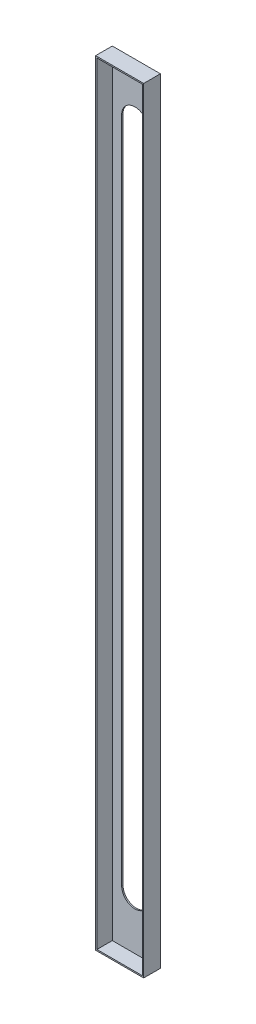
ISO-10303-21;
HEADER;
FILE_DESCRIPTION(('STEP AP214'),'2;1');
FILE_NAME('part.step','',(''),(''),'','','');
FILE_SCHEMA(('AUTOMOTIVE_DESIGN { 1 0 10303 214 1 1 1 1 }'));
ENDSEC;
DATA;
#1=APPLICATION_CONTEXT('core data for automotive mechanical design processes');
#2=APPLICATION_PROTOCOL_DEFINITION('international standard','automotive_design',2000,#1);
#3=PRODUCT_CONTEXT('',#1,'mechanical');
#4=PRODUCT('Part','Part','',(#3));
#5=PRODUCT_RELATED_PRODUCT_CATEGORY('part','',(#4));
#6=PRODUCT_DEFINITION_FORMATION('','',#4);
#7=PRODUCT_DEFINITION_CONTEXT('part definition',#1,'design');
#8=PRODUCT_DEFINITION('design','',#6,#7);
#9=PRODUCT_DEFINITION_SHAPE('','',#8);
#10=(LENGTH_UNIT() NAMED_UNIT(*) SI_UNIT(.MILLI.,.METRE.));
#11=(NAMED_UNIT(*) PLANE_ANGLE_UNIT() SI_UNIT($,.RADIAN.));
#12=(NAMED_UNIT(*) SI_UNIT($,.STERADIAN.) SOLID_ANGLE_UNIT());
#13=UNCERTAINTY_MEASURE_WITH_UNIT(LENGTH_MEASURE(1.E-05),#10,'distance_accuracy_value','');
#14=(GEOMETRIC_REPRESENTATION_CONTEXT(3) GLOBAL_UNCERTAINTY_ASSIGNED_CONTEXT((#13)) GLOBAL_UNIT_ASSIGNED_CONTEXT((#10,
#11,#12)) REPRESENTATION_CONTEXT('',''));
#15=CARTESIAN_POINT('',(0.,0.,0.));
#16=DIRECTION('',(0.,0.,1.));
#17=DIRECTION('',(1.,0.,0.));
#18=AXIS2_PLACEMENT_3D('',#15,#16,#17);
#19=CARTESIAN_POINT('',(0.,0.,0.2));
#20=DIRECTION('',(0.,0.,-1.));
#21=DIRECTION('',(-1.,0.,0.));
#22=AXIS2_PLACEMENT_3D('',#19,#20,#21);
#23=PLANE('',#22);
#24=DIRECTION('',(0.,-1.,0.));
#25=VECTOR('',#24,1.);
#26=CARTESIAN_POINT('',(0.2,0.,0.2));
#27=LINE('',#26,#25);
#28=CARTESIAN_POINT('',(0.2,115.8,0.2));
#29=VERTEX_POINT('',#28);
#30=CARTESIAN_POINT('',(0.2,0.2,0.2));
#31=VERTEX_POINT('',#30);
#32=EDGE_CURVE('E158',#29,#31,#27,.T.);
#33=ORIENTED_EDGE('',*,*,#32,.T.);
#34=DIRECTION('',(1.,0.,0.));
#35=VECTOR('',#34,1.);
#36=CARTESIAN_POINT('',(0.,0.2,0.2));
#37=LINE('',#36,#35);
#38=CARTESIAN_POINT('',(7.,0.2,0.2));
#39=VERTEX_POINT('',#38);
#40=EDGE_CURVE('E167',#31,#39,#37,.T.);
#41=ORIENTED_EDGE('',*,*,#40,.T.);
#42=DIRECTION('',(0.,1.,0.));
#43=VECTOR('',#42,1.);
#44=CARTESIAN_POINT('',(7.,0.,0.2));
#45=LINE('',#44,#43);
#46=CARTESIAN_POINT('',(7.,115.8,0.2));
#47=VERTEX_POINT('',#46);
#48=EDGE_CURVE('E182',#39,#47,#45,.T.);
#49=ORIENTED_EDGE('',*,*,#48,.T.);
#50=DIRECTION('',(-1.,0.,0.));
#51=VECTOR('',#50,1.);
#52=CARTESIAN_POINT('',(0.,115.8,0.2));
#53=LINE('',#52,#51);
#54=EDGE_CURVE('E188',#47,#29,#53,.T.);
#55=ORIENTED_EDGE('',*,*,#54,.T.);
#56=EDGE_LOOP('',(#33,#41,#49,#55));
#57=FACE_BOUND('',#56,.T.);
#58=CARTESIAN_POINT('',(3.6,108.,0.2));
#59=DIRECTION('',(0.,0.,1.));
#60=DIRECTION('',(1.,0.,0.));
#61=AXIS2_PLACEMENT_3D('',#58,#59,#60);
#62=CIRCLE('',#61,2.);
#63=CARTESIAN_POINT('',(5.6,108.,0.2));
#64=VERTEX_POINT('',#63);
#65=CARTESIAN_POINT('',(1.6,108.,0.2));
#66=VERTEX_POINT('',#65);
#67=EDGE_CURVE('E140',#64,#66,#62,.T.);
#68=ORIENTED_EDGE('',*,*,#67,.F.);
#69=DIRECTION('',(0.,1.,0.));
#70=VECTOR('',#69,1.);
#71=CARTESIAN_POINT('',(5.6,108.,0.2));
#72=LINE('',#71,#70);
#73=CARTESIAN_POINT('',(5.60000000000003,8.,0.2));
#74=VERTEX_POINT('',#73);
#75=EDGE_CURVE('E137',#74,#64,#72,.T.);
#76=ORIENTED_EDGE('',*,*,#75,.F.);
#77=CARTESIAN_POINT('',(3.60000000000002,8.,0.2));
#78=DIRECTION('',(0.,0.,1.));
#79=DIRECTION('',(-1.,0.,0.));
#80=AXIS2_PLACEMENT_3D('',#77,#78,#79);
#81=CIRCLE('',#80,2.00000000000001);
#82=CARTESIAN_POINT('',(1.60000000000001,8.,0.2));
#83=VERTEX_POINT('',#82);
#84=EDGE_CURVE('E55',#83,#74,#81,.T.);
#85=ORIENTED_EDGE('',*,*,#84,.F.);
#86=DIRECTION('',(0.,-1.,0.));
#87=VECTOR('',#86,1.);
#88=CARTESIAN_POINT('',(1.6,108.,0.2));
#89=LINE('',#88,#87);
#90=EDGE_CURVE('E131',#66,#83,#89,.T.);
#91=ORIENTED_EDGE('',*,*,#90,.F.);
#92=EDGE_LOOP('',(#68,#76,#85,#91));
#93=FACE_BOUND('',#92,.T.);
#94=ADVANCED_FACE('F39',(#57,#93),#23,.F.);
#95=CARTESIAN_POINT('',(0.,0.,2.5));
#96=DIRECTION('',(0.,0.,-1.));
#97=DIRECTION('',(-1.,0.,0.));
#98=AXIS2_PLACEMENT_3D('',#95,#96,#97);
#99=PLANE('',#98);
#100=DIRECTION('',(0.,-1.,0.));
#101=VECTOR('',#100,1.);
#102=CARTESIAN_POINT('',(0.,0.,2.5));
#103=LINE('',#102,#101);
#104=CARTESIAN_POINT('',(0.,116.,2.5));
#105=VERTEX_POINT('',#104);
#106=CARTESIAN_POINT('',(0.,0.,2.5));
#107=VERTEX_POINT('',#106);
#108=EDGE_CURVE('E206',#105,#107,#103,.T.);
#109=ORIENTED_EDGE('',*,*,#108,.T.);
#110=DIRECTION('',(1.,0.,0.));
#111=VECTOR('',#110,1.);
#112=CARTESIAN_POINT('',(0.,0.,2.5));
#113=LINE('',#112,#111);
#114=CARTESIAN_POINT('',(7.2,0.,2.5));
#115=VERTEX_POINT('',#114);
#116=EDGE_CURVE('E210',#107,#115,#113,.T.);
#117=ORIENTED_EDGE('',*,*,#116,.T.);
#118=DIRECTION('',(0.,1.,0.));
#119=VECTOR('',#118,1.);
#120=CARTESIAN_POINT('',(7.2,0.,2.5));
#121=LINE('',#120,#119);
#122=CARTESIAN_POINT('',(7.2,116.,2.5));
#123=VERTEX_POINT('',#122);
#124=EDGE_CURVE('E214',#115,#123,#121,.T.);
#125=ORIENTED_EDGE('',*,*,#124,.T.);
#126=DIRECTION('',(-1.,0.,0.));
#127=VECTOR('',#126,1.);
#128=CARTESIAN_POINT('',(0.,116.,2.5));
#129=LINE('',#128,#127);
#130=EDGE_CURVE('E217',#123,#105,#129,.T.);
#131=ORIENTED_EDGE('',*,*,#130,.T.);
#132=EDGE_LOOP('',(#109,#117,#125,#131));
#133=FACE_BOUND('',#132,.T.);
#134=DIRECTION('',(0.,-1.,0.));
#135=VECTOR('',#134,1.);
#136=CARTESIAN_POINT('',(0.2,0.,2.5));
#137=LINE('',#136,#135);
#138=CARTESIAN_POINT('',(0.2,115.8,2.5));
#139=VERTEX_POINT('',#138);
#140=CARTESIAN_POINT('',(0.2,0.2,2.5));
#141=VERTEX_POINT('',#140);
#142=EDGE_CURVE('E194',#139,#141,#137,.T.);
#143=ORIENTED_EDGE('',*,*,#142,.F.);
#144=DIRECTION('',(-1.,0.,0.));
#145=VECTOR('',#144,1.);
#146=CARTESIAN_POINT('',(0.,115.8,2.5));
#147=LINE('',#146,#145);
#148=CARTESIAN_POINT('',(7.,115.8,2.5));
#149=VERTEX_POINT('',#148);
#150=EDGE_CURVE('E179',#149,#139,#147,.T.);
#151=ORIENTED_EDGE('',*,*,#150,.F.);
#152=DIRECTION('',(0.,1.,0.));
#153=VECTOR('',#152,1.);
#154=CARTESIAN_POINT('',(7.,0.,2.5));
#155=LINE('',#154,#153);
#156=CARTESIAN_POINT('',(7.,0.2,2.5));
#157=VERTEX_POINT('',#156);
#158=EDGE_CURVE('E200',#157,#149,#155,.T.);
#159=ORIENTED_EDGE('',*,*,#158,.F.);
#160=DIRECTION('',(1.,0.,0.));
#161=VECTOR('',#160,1.);
#162=CARTESIAN_POINT('',(0.,0.2,2.5));
#163=LINE('',#162,#161);
#164=EDGE_CURVE('E197',#141,#157,#163,.T.);
#165=ORIENTED_EDGE('',*,*,#164,.F.);
#166=EDGE_LOOP('',(#143,#151,#159,#165));
#167=FACE_BOUND('',#166,.T.);
#168=ADVANCED_FACE('F281',(#133,#167),#99,.F.);
#169=CARTESIAN_POINT('',(0.,0.,2.5));
#170=DIRECTION('',(1.,0.,0.));
#171=DIRECTION('',(0.,0.,-1.));
#172=AXIS2_PLACEMENT_3D('',#169,#170,#171);
#173=PLANE('',#172);
#174=DIRECTION('',(0.,-1.,0.));
#175=VECTOR('',#174,1.);
#176=CARTESIAN_POINT('',(0.,0.,0.));
#177=LINE('',#176,#175);
#178=CARTESIAN_POINT('',(0.,116.,0.));
#179=VERTEX_POINT('',#178);
#180=CARTESIAN_POINT('',(0.,0.,0.));
#181=VERTEX_POINT('',#180);
#182=EDGE_CURVE('E172',#179,#181,#177,.T.);
#183=ORIENTED_EDGE('',*,*,#182,.T.);
#184=DIRECTION('',(0.,0.,-1.));
#185=VECTOR('',#184,1.);
#186=CARTESIAN_POINT('',(0.,0.,2.5));
#187=LINE('',#186,#185);
#188=EDGE_CURVE('E243',#107,#181,#187,.T.);
#189=ORIENTED_EDGE('',*,*,#188,.F.);
#190=ORIENTED_EDGE('',*,*,#108,.F.);
#191=DIRECTION('',(0.,0.,-1.));
#192=VECTOR('',#191,1.);
#193=CARTESIAN_POINT('',(0.,116.,2.5));
#194=LINE('',#193,#192);
#195=EDGE_CURVE('E220',#105,#179,#194,.T.);
#196=ORIENTED_EDGE('',*,*,#195,.T.);
#197=EDGE_LOOP('',(#183,#189,#190,#196));
#198=FACE_BOUND('',#197,.T.);
#199=ADVANCED_FACE('F41',(#198),#173,.F.);
#200=CARTESIAN_POINT('',(0.,0.,2.5));
#201=DIRECTION('',(0.,1.,0.));
#202=DIRECTION('',(0.,0.,1.));
#203=AXIS2_PLACEMENT_3D('',#200,#201,#202);
#204=PLANE('',#203);
#205=DIRECTION('',(1.,0.,0.));
#206=VECTOR('',#205,1.);
#207=CARTESIAN_POINT('',(0.,0.,0.));
#208=LINE('',#207,#206);
#209=CARTESIAN_POINT('',(7.2,0.,0.));
#210=VERTEX_POINT('',#209);
#211=EDGE_CURVE('E224',#181,#210,#208,.T.);
#212=ORIENTED_EDGE('',*,*,#211,.T.);
#213=DIRECTION('',(0.,0.,-1.));
#214=VECTOR('',#213,1.);
#215=CARTESIAN_POINT('',(7.2,0.,2.5));
#216=LINE('',#215,#214);
#217=EDGE_CURVE('E239',#115,#210,#216,.T.);
#218=ORIENTED_EDGE('',*,*,#217,.F.);
#219=ORIENTED_EDGE('',*,*,#116,.F.);
#220=ORIENTED_EDGE('',*,*,#188,.T.);
#221=EDGE_LOOP('',(#212,#218,#219,#220));
#222=FACE_BOUND('',#221,.T.);
#223=ADVANCED_FACE('F279',(#222),#204,.F.);
#224=CARTESIAN_POINT('',(7.2,0.,2.5));
#225=DIRECTION('',(-1.,0.,0.));
#226=DIRECTION('',(0.,-1.,0.));
#227=AXIS2_PLACEMENT_3D('',#224,#225,#226);
#228=PLANE('',#227);
#229=DIRECTION('',(0.,1.,0.));
#230=VECTOR('',#229,1.);
#231=CARTESIAN_POINT('',(7.2,0.,0.));
#232=LINE('',#231,#230);
#233=CARTESIAN_POINT('',(7.2,116.,0.));
#234=VERTEX_POINT('',#233);
#235=EDGE_CURVE('E227',#210,#234,#232,.T.);
#236=ORIENTED_EDGE('',*,*,#235,.T.);
#237=DIRECTION('',(0.,0.,-1.));
#238=VECTOR('',#237,1.);
#239=CARTESIAN_POINT('',(7.2,116.,2.5));
#240=LINE('',#239,#238);
#241=EDGE_CURVE('E235',#123,#234,#240,.T.);
#242=ORIENTED_EDGE('',*,*,#241,.F.);
#243=ORIENTED_EDGE('',*,*,#124,.F.);
#244=ORIENTED_EDGE('',*,*,#217,.T.);
#245=EDGE_LOOP('',(#236,#242,#243,#244));
#246=FACE_BOUND('',#245,.T.);
#247=ADVANCED_FACE('F276',(#246),#228,.F.);
#248=CARTESIAN_POINT('',(0.,116.,2.5));
#249=DIRECTION('',(0.,-1.,0.));
#250=DIRECTION('',(0.,0.,-1.));
#251=AXIS2_PLACEMENT_3D('',#248,#249,#250);
#252=PLANE('',#251);
#253=DIRECTION('',(-1.,0.,0.));
#254=VECTOR('',#253,1.);
#255=CARTESIAN_POINT('',(0.,116.,0.));
#256=LINE('',#255,#254);
#257=EDGE_CURVE('E211',#234,#179,#256,.T.);
#258=ORIENTED_EDGE('',*,*,#257,.T.);
#259=ORIENTED_EDGE('',*,*,#195,.F.);
#260=ORIENTED_EDGE('',*,*,#130,.F.);
#261=ORIENTED_EDGE('',*,*,#241,.T.);
#262=EDGE_LOOP('',(#258,#259,#260,#261));
#263=FACE_BOUND('',#262,.T.);
#264=ADVANCED_FACE('F262',(#263),#252,.F.);
#265=CARTESIAN_POINT('',(0.,0.,0.));
#266=DIRECTION('',(0.,0.,-1.));
#267=DIRECTION('',(-1.,0.,0.));
#268=AXIS2_PLACEMENT_3D('',#265,#266,#267);
#269=PLANE('',#268);
#270=CARTESIAN_POINT('',(3.6,108.,0.));
#271=DIRECTION('',(0.,0.,-1.));
#272=DIRECTION('',(-1.,0.,0.));
#273=AXIS2_PLACEMENT_3D('',#270,#271,#272);
#274=CIRCLE('',#273,2.);
#275=CARTESIAN_POINT('',(1.6,108.,0.));
#276=VERTEX_POINT('',#275);
#277=CARTESIAN_POINT('',(5.6,108.,0.));
#278=VERTEX_POINT('',#277);
#279=EDGE_CURVE('E11',#276,#278,#274,.T.);
#280=ORIENTED_EDGE('',*,*,#279,.F.);
#281=DIRECTION('',(0.,1.,0.));
#282=VECTOR('',#281,1.);
#283=CARTESIAN_POINT('',(1.60000000000001,0.,0.));
#284=LINE('',#283,#282);
#285=CARTESIAN_POINT('',(1.60000000000001,8.,0.));
#286=VERTEX_POINT('',#285);
#287=EDGE_CURVE('E133',#286,#276,#284,.T.);
#288=ORIENTED_EDGE('',*,*,#287,.F.);
#289=CARTESIAN_POINT('',(3.60000000000002,8.,0.));
#290=DIRECTION('',(0.,0.,-1.));
#291=DIRECTION('',(-1.,0.,0.));
#292=AXIS2_PLACEMENT_3D('',#289,#290,#291);
#293=CIRCLE('',#292,2.00000000000001);
#294=CARTESIAN_POINT('',(5.60000000000003,8.,0.));
#295=VERTEX_POINT('',#294);
#296=EDGE_CURVE('E249',#295,#286,#293,.T.);
#297=ORIENTED_EDGE('',*,*,#296,.F.);
#298=DIRECTION('',(0.,-1.,0.));
#299=VECTOR('',#298,1.);
#300=CARTESIAN_POINT('',(5.60000000000003,0.,0.));
#301=LINE('',#300,#299);
#302=EDGE_CURVE('E48',#278,#295,#301,.T.);
#303=ORIENTED_EDGE('',*,*,#302,.F.);
#304=EDGE_LOOP('',(#280,#288,#297,#303));
#305=FACE_BOUND('',#304,.T.);
#306=ORIENTED_EDGE('',*,*,#182,.F.);
#307=ORIENTED_EDGE('',*,*,#257,.F.);
#308=ORIENTED_EDGE('',*,*,#235,.F.);
#309=ORIENTED_EDGE('',*,*,#211,.F.);
#310=EDGE_LOOP('',(#306,#307,#308,#309));
#311=FACE_BOUND('',#310,.T.);
#312=ADVANCED_FACE('F258',(#305,#311),#269,.T.);
#313=CARTESIAN_POINT('',(0.2,0.,2.5));
#314=DIRECTION('',(1.,0.,0.));
#315=DIRECTION('',(0.,0.,-1.));
#316=AXIS2_PLACEMENT_3D('',#313,#314,#315);
#317=PLANE('',#316);
#318=ORIENTED_EDGE('',*,*,#32,.F.);
#319=DIRECTION('',(0.,0.,-1.));
#320=VECTOR('',#319,1.);
#321=CARTESIAN_POINT('',(0.2,115.8,2.5));
#322=LINE('',#321,#320);
#323=EDGE_CURVE('E174',#139,#29,#322,.T.);
#324=ORIENTED_EDGE('',*,*,#323,.F.);
#325=ORIENTED_EDGE('',*,*,#142,.T.);
#326=DIRECTION('',(0.,0.,-1.));
#327=VECTOR('',#326,1.);
#328=CARTESIAN_POINT('',(0.2,0.2,2.5));
#329=LINE('',#328,#327);
#330=EDGE_CURVE('E168',#141,#31,#329,.T.);
#331=ORIENTED_EDGE('',*,*,#330,.T.);
#332=EDGE_LOOP('',(#318,#324,#325,#331));
#333=FACE_BOUND('',#332,.T.);
#334=ADVANCED_FACE('F261',(#333),#317,.T.);
#335=CARTESIAN_POINT('',(0.,0.2,2.5));
#336=DIRECTION('',(0.,1.,0.));
#337=DIRECTION('',(0.,0.,1.));
#338=AXIS2_PLACEMENT_3D('',#335,#336,#337);
#339=PLANE('',#338);
#340=ORIENTED_EDGE('',*,*,#40,.F.);
#341=ORIENTED_EDGE('',*,*,#330,.F.);
#342=ORIENTED_EDGE('',*,*,#164,.T.);
#343=DIRECTION('',(0.,0.,-1.));
#344=VECTOR('',#343,1.);
#345=CARTESIAN_POINT('',(7.,0.2,2.5));
#346=LINE('',#345,#344);
#347=EDGE_CURVE('E173',#157,#39,#346,.T.);
#348=ORIENTED_EDGE('',*,*,#347,.T.);
#349=EDGE_LOOP('',(#340,#341,#342,#348));
#350=FACE_BOUND('',#349,.T.);
#351=ADVANCED_FACE('F294',(#350),#339,.T.);
#352=CARTESIAN_POINT('',(7.,0.,2.5));
#353=DIRECTION('',(-1.,0.,0.));
#354=DIRECTION('',(0.,-1.,0.));
#355=AXIS2_PLACEMENT_3D('',#352,#353,#354);
#356=PLANE('',#355);
#357=ORIENTED_EDGE('',*,*,#48,.F.);
#358=ORIENTED_EDGE('',*,*,#347,.F.);
#359=ORIENTED_EDGE('',*,*,#158,.T.);
#360=DIRECTION('',(0.,0.,-1.));
#361=VECTOR('',#360,1.);
#362=CARTESIAN_POINT('',(7.,115.8,2.5));
#363=LINE('',#362,#361);
#364=EDGE_CURVE('E178',#149,#47,#363,.T.);
#365=ORIENTED_EDGE('',*,*,#364,.T.);
#366=EDGE_LOOP('',(#357,#358,#359,#365));
#367=FACE_BOUND('',#366,.T.);
#368=ADVANCED_FACE('F302',(#367),#356,.T.);
#369=CARTESIAN_POINT('',(0.,115.8,2.5));
#370=DIRECTION('',(0.,-1.,0.));
#371=DIRECTION('',(0.,0.,-1.));
#372=AXIS2_PLACEMENT_3D('',#369,#370,#371);
#373=PLANE('',#372);
#374=ORIENTED_EDGE('',*,*,#54,.F.);
#375=ORIENTED_EDGE('',*,*,#364,.F.);
#376=ORIENTED_EDGE('',*,*,#150,.T.);
#377=ORIENTED_EDGE('',*,*,#323,.T.);
#378=EDGE_LOOP('',(#374,#375,#376,#377));
#379=FACE_BOUND('',#378,.T.);
#380=ADVANCED_FACE('F300',(#379),#373,.T.);
#381=CARTESIAN_POINT('',(3.6,108.,-2.3));
#382=DIRECTION('',(0.,0.,1.));
#383=DIRECTION('',(1.,0.,0.));
#384=AXIS2_PLACEMENT_3D('',#381,#382,#383);
#385=CYLINDRICAL_SURFACE('',#384,2.);
#386=ORIENTED_EDGE('',*,*,#279,.T.);
#387=DIRECTION('',(0.,0.,1.));
#388=VECTOR('',#387,1.);
#389=CARTESIAN_POINT('',(5.6,108.,-2.3));
#390=LINE('',#389,#388);
#391=EDGE_CURVE('E143',#278,#64,#390,.T.);
#392=ORIENTED_EDGE('',*,*,#391,.T.);
#393=ORIENTED_EDGE('',*,*,#67,.T.);
#394=DIRECTION('',(0.,0.,1.));
#395=VECTOR('',#394,1.);
#396=CARTESIAN_POINT('',(1.6,108.,-2.3));
#397=LINE('',#396,#395);
#398=EDGE_CURVE('E127',#276,#66,#397,.T.);
#399=ORIENTED_EDGE('',*,*,#398,.F.);
#400=EDGE_LOOP('',(#386,#392,#393,#399));
#401=FACE_BOUND('',#400,.T.);
#402=ADVANCED_FACE('F141',(#401),#385,.F.);
#403=CARTESIAN_POINT('',(5.6,108.,-2.3));
#404=DIRECTION('',(1.,0.,0.));
#405=DIRECTION('',(0.,1.,0.));
#406=AXIS2_PLACEMENT_3D('',#403,#404,#405);
#407=PLANE('',#406);
#408=ORIENTED_EDGE('',*,*,#302,.T.);
#409=DIRECTION('',(0.,0.,1.));
#410=VECTOR('',#409,1.);
#411=CARTESIAN_POINT('',(5.60000000000003,8.,-2.3));
#412=LINE('',#411,#410);
#413=EDGE_CURVE('E159',#295,#74,#412,.T.);
#414=ORIENTED_EDGE('',*,*,#413,.T.);
#415=ORIENTED_EDGE('',*,*,#75,.T.);
#416=ORIENTED_EDGE('',*,*,#391,.F.);
#417=EDGE_LOOP('',(#408,#414,#415,#416));
#418=FACE_BOUND('',#417,.T.);
#419=ADVANCED_FACE('F254',(#418),#407,.F.);
#420=CARTESIAN_POINT('',(3.60000000000002,8.,-2.3));
#421=DIRECTION('',(0.,0.,1.));
#422=DIRECTION('',(1.,0.,0.));
#423=AXIS2_PLACEMENT_3D('',#420,#421,#422);
#424=CYLINDRICAL_SURFACE('',#423,2.00000000000001);
#425=ORIENTED_EDGE('',*,*,#296,.T.);
#426=DIRECTION('',(0.,0.,1.));
#427=VECTOR('',#426,1.);
#428=CARTESIAN_POINT('',(1.60000000000001,8.,-2.3));
#429=LINE('',#428,#427);
#430=EDGE_CURVE('E62',#286,#83,#429,.T.);
#431=ORIENTED_EDGE('',*,*,#430,.T.);
#432=ORIENTED_EDGE('',*,*,#84,.T.);
#433=ORIENTED_EDGE('',*,*,#413,.F.);
#434=EDGE_LOOP('',(#425,#431,#432,#433));
#435=FACE_BOUND('',#434,.T.);
#436=ADVANCED_FACE('F257',(#435),#424,.F.);
#437=CARTESIAN_POINT('',(1.6,108.,-2.3));
#438=DIRECTION('',(-1.,0.,0.));
#439=DIRECTION('',(0.,-1.,0.));
#440=AXIS2_PLACEMENT_3D('',#437,#438,#439);
#441=PLANE('',#440);
#442=ORIENTED_EDGE('',*,*,#287,.T.);
#443=ORIENTED_EDGE('',*,*,#398,.T.);
#444=ORIENTED_EDGE('',*,*,#90,.T.);
#445=ORIENTED_EDGE('',*,*,#430,.F.);
#446=EDGE_LOOP('',(#442,#443,#444,#445));
#447=FACE_BOUND('',#446,.T.);
#448=ADVANCED_FACE('F129',(#447),#441,.F.);
#449=CLOSED_SHELL('',(#94,#168,#199,#223,#247,#264,#312,#334,#351,#368,#380,#402,#419,#436,#448));
#450=MANIFOLD_SOLID_BREP('B2',#449);
#451=ADVANCED_BREP_SHAPE_REPRESENTATION('',(#18,#450),#14);
#452=SHAPE_DEFINITION_REPRESENTATION(#9,#451);
ENDSEC;
END-ISO-10303-21;
